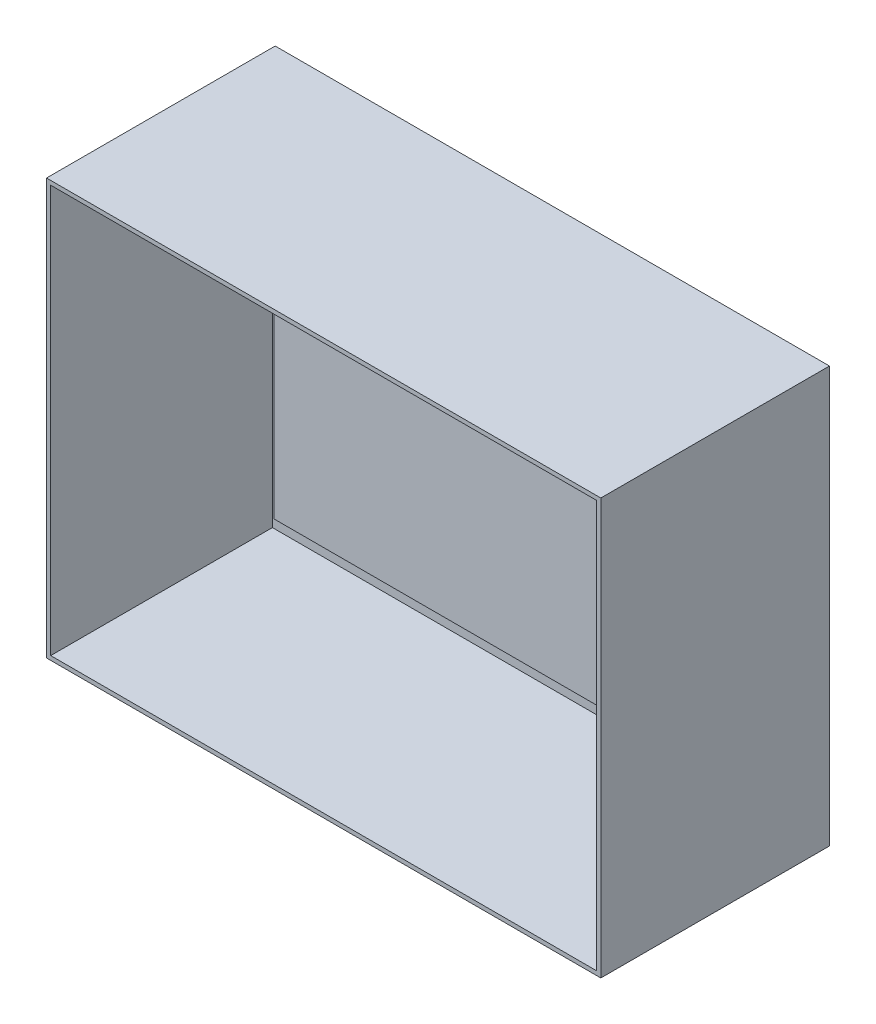
ISO-10303-21;
HEADER;
FILE_DESCRIPTION(('STEP AP214'),'2;1');
FILE_NAME('part.step','',(''),(''),'','','');
FILE_SCHEMA(('AUTOMOTIVE_DESIGN { 1 0 10303 214 1 1 1 1 }'));
ENDSEC;
DATA;
#1=APPLICATION_CONTEXT('core data for automotive mechanical design processes');
#2=APPLICATION_PROTOCOL_DEFINITION('international standard','automotive_design',2000,#1);
#3=PRODUCT_CONTEXT('',#1,'mechanical');
#4=PRODUCT('Part','Part','',(#3));
#5=PRODUCT_RELATED_PRODUCT_CATEGORY('part','',(#4));
#6=PRODUCT_DEFINITION_FORMATION('','',#4);
#7=PRODUCT_DEFINITION_CONTEXT('part definition',#1,'design');
#8=PRODUCT_DEFINITION('design','',#6,#7);
#9=PRODUCT_DEFINITION_SHAPE('','',#8);
#10=(LENGTH_UNIT() NAMED_UNIT(*) SI_UNIT(.MILLI.,.METRE.));
#11=(NAMED_UNIT(*) PLANE_ANGLE_UNIT() SI_UNIT($,.RADIAN.));
#12=(NAMED_UNIT(*) SI_UNIT($,.STERADIAN.) SOLID_ANGLE_UNIT());
#13=UNCERTAINTY_MEASURE_WITH_UNIT(LENGTH_MEASURE(1.E-05),#10,'distance_accuracy_value','');
#14=(GEOMETRIC_REPRESENTATION_CONTEXT(3) GLOBAL_UNCERTAINTY_ASSIGNED_CONTEXT((#13)) GLOBAL_UNIT_ASSIGNED_CONTEXT((#10,
#11,#12)) REPRESENTATION_CONTEXT('',''));
#15=CARTESIAN_POINT('',(0.,0.,0.));
#16=DIRECTION('',(0.,0.,1.));
#17=DIRECTION('',(1.,0.,0.));
#18=AXIS2_PLACEMENT_3D('',#15,#16,#17);
#19=CARTESIAN_POINT('',(0.,0.,5.));
#20=DIRECTION('',(0.,0.,1.));
#21=DIRECTION('',(1.,0.,0.));
#22=AXIS2_PLACEMENT_3D('',#19,#20,#21);
#23=PLANE('',#22);
#24=DIRECTION('',(0.,1.,0.));
#25=VECTOR('',#24,1.);
#26=CARTESIAN_POINT('',(-197.,0.,5.));
#27=LINE('',#26,#25);
#28=CARTESIAN_POINT('',(-197.,-147.,5.));
#29=VERTEX_POINT('',#28);
#30=CARTESIAN_POINT('',(-197.,147.,5.));
#31=VERTEX_POINT('',#30);
#32=EDGE_CURVE('E56',#29,#31,#27,.T.);
#33=ORIENTED_EDGE('',*,*,#32,.F.);
#34=DIRECTION('',(-1.,0.,0.));
#35=VECTOR('',#34,1.);
#36=CARTESIAN_POINT('',(0.,-147.,5.));
#37=LINE('',#36,#35);
#38=CARTESIAN_POINT('',(197.,-147.,5.));
#39=VERTEX_POINT('',#38);
#40=EDGE_CURVE('E187',#39,#29,#37,.T.);
#41=ORIENTED_EDGE('',*,*,#40,.F.);
#42=DIRECTION('',(0.,-1.,0.));
#43=VECTOR('',#42,1.);
#44=CARTESIAN_POINT('',(197.,0.,5.));
#45=LINE('',#44,#43);
#46=CARTESIAN_POINT('',(197.,147.,5.));
#47=VERTEX_POINT('',#46);
#48=EDGE_CURVE('E184',#47,#39,#45,.T.);
#49=ORIENTED_EDGE('',*,*,#48,.F.);
#50=DIRECTION('',(1.,0.,0.));
#51=VECTOR('',#50,1.);
#52=CARTESIAN_POINT('',(0.,147.,5.));
#53=LINE('',#52,#51);
#54=EDGE_CURVE('E181',#31,#47,#53,.T.);
#55=ORIENTED_EDGE('',*,*,#54,.F.);
#56=EDGE_LOOP('',(#33,#41,#49,#55));
#57=FACE_BOUND('',#56,.T.);
#58=DIRECTION('',(1.,0.,0.));
#59=VECTOR('',#58,1.);
#60=CARTESIAN_POINT('',(0.,120.,5.));
#61=LINE('',#60,#59);
#62=CARTESIAN_POINT('',(-175.,120.,5.00000000000001));
#63=VERTEX_POINT('',#62);
#64=CARTESIAN_POINT('',(175.,120.,5.00000000000001));
#65=VERTEX_POINT('',#64);
#66=EDGE_CURVE('E41',#63,#65,#61,.T.);
#67=ORIENTED_EDGE('',*,*,#66,.T.);
#68=DIRECTION('',(0.,-1.,0.));
#69=VECTOR('',#68,1.);
#70=CARTESIAN_POINT('',(175.,0.,5.));
#71=LINE('',#70,#69);
#72=CARTESIAN_POINT('',(175.,-120.,5.00000000000001));
#73=VERTEX_POINT('',#72);
#74=EDGE_CURVE('E11',#65,#73,#71,.T.);
#75=ORIENTED_EDGE('',*,*,#74,.T.);
#76=DIRECTION('',(-1.,0.,0.));
#77=VECTOR('',#76,1.);
#78=CARTESIAN_POINT('',(0.,-120.,5.));
#79=LINE('',#78,#77);
#80=CARTESIAN_POINT('',(-175.,-120.,5.));
#81=VERTEX_POINT('',#80);
#82=EDGE_CURVE('E211',#73,#81,#79,.T.);
#83=ORIENTED_EDGE('',*,*,#82,.T.);
#84=DIRECTION('',(0.,1.,0.));
#85=VECTOR('',#84,1.);
#86=CARTESIAN_POINT('',(-175.,0.,5.));
#87=LINE('',#86,#85);
#88=EDGE_CURVE('E214',#81,#63,#87,.T.);
#89=ORIENTED_EDGE('',*,*,#88,.T.);
#90=EDGE_LOOP('',(#67,#75,#83,#89));
#91=FACE_BOUND('',#90,.T.);
#92=ADVANCED_FACE('F33',(#57,#91),#23,.T.);
#93=CARTESIAN_POINT('',(200.,150.,5.));
#94=DIRECTION('',(-1.,0.,0.));
#95=DIRECTION('',(0.,-1.,0.));
#96=AXIS2_PLACEMENT_3D('',#93,#94,#95);
#97=PLANE('',#96);
#98=DIRECTION('',(0.,1.,0.));
#99=VECTOR('',#98,1.);
#100=CARTESIAN_POINT('',(200.,150.,0.));
#101=LINE('',#100,#99);
#102=CARTESIAN_POINT('',(200.,-150.,0.));
#103=VERTEX_POINT('',#102);
#104=CARTESIAN_POINT('',(200.,150.,0.));
#105=VERTEX_POINT('',#104);
#106=EDGE_CURVE('E190',#103,#105,#101,.T.);
#107=ORIENTED_EDGE('',*,*,#106,.T.);
#108=DIRECTION('',(0.,0.,-1.));
#109=VECTOR('',#108,1.);
#110=CARTESIAN_POINT('',(200.,150.,5.));
#111=LINE('',#110,#109);
#112=CARTESIAN_POINT('',(200.,150.,165.));
#113=VERTEX_POINT('',#112);
#114=EDGE_CURVE('E208',#113,#105,#111,.T.);
#115=ORIENTED_EDGE('',*,*,#114,.F.);
#116=DIRECTION('',(0.,1.,0.));
#117=VECTOR('',#116,1.);
#118=CARTESIAN_POINT('',(200.,150.,165.));
#119=LINE('',#118,#117);
#120=CARTESIAN_POINT('',(200.,-150.,165.));
#121=VERTEX_POINT('',#120);
#122=EDGE_CURVE('E175',#121,#113,#119,.T.);
#123=ORIENTED_EDGE('',*,*,#122,.F.);
#124=DIRECTION('',(0.,0.,-1.));
#125=VECTOR('',#124,1.);
#126=CARTESIAN_POINT('',(200.,-150.,5.));
#127=LINE('',#126,#125);
#128=EDGE_CURVE('E199',#121,#103,#127,.T.);
#129=ORIENTED_EDGE('',*,*,#128,.T.);
#130=EDGE_LOOP('',(#107,#115,#123,#129));
#131=FACE_BOUND('',#130,.T.);
#132=ADVANCED_FACE('F35',(#131),#97,.F.);
#133=CARTESIAN_POINT('',(-200.,150.,5.));
#134=DIRECTION('',(0.,-1.,0.));
#135=DIRECTION('',(0.,0.,-1.));
#136=AXIS2_PLACEMENT_3D('',#133,#134,#135);
#137=PLANE('',#136);
#138=DIRECTION('',(-1.,0.,0.));
#139=VECTOR('',#138,1.);
#140=CARTESIAN_POINT('',(-200.,150.,0.));
#141=LINE('',#140,#139);
#142=CARTESIAN_POINT('',(-200.,150.,0.));
#143=VERTEX_POINT('',#142);
#144=EDGE_CURVE('E193',#105,#143,#141,.T.);
#145=ORIENTED_EDGE('',*,*,#144,.T.);
#146=DIRECTION('',(0.,0.,-1.));
#147=VECTOR('',#146,1.);
#148=CARTESIAN_POINT('',(-200.,150.,5.));
#149=LINE('',#148,#147);
#150=CARTESIAN_POINT('',(-200.,150.,165.));
#151=VERTEX_POINT('',#150);
#152=EDGE_CURVE('E205',#151,#143,#149,.T.);
#153=ORIENTED_EDGE('',*,*,#152,.F.);
#154=DIRECTION('',(-1.,0.,0.));
#155=VECTOR('',#154,1.);
#156=CARTESIAN_POINT('',(-200.,150.,165.));
#157=LINE('',#156,#155);
#158=EDGE_CURVE('E178',#113,#151,#157,.T.);
#159=ORIENTED_EDGE('',*,*,#158,.F.);
#160=ORIENTED_EDGE('',*,*,#114,.T.);
#161=EDGE_LOOP('',(#145,#153,#159,#160));
#162=FACE_BOUND('',#161,.T.);
#163=ADVANCED_FACE('F237',(#162),#137,.F.);
#164=CARTESIAN_POINT('',(-200.,150.,5.));
#165=DIRECTION('',(1.,0.,0.));
#166=DIRECTION('',(0.,1.,0.));
#167=AXIS2_PLACEMENT_3D('',#164,#165,#166);
#168=PLANE('',#167);
#169=DIRECTION('',(0.,-1.,0.));
#170=VECTOR('',#169,1.);
#171=CARTESIAN_POINT('',(-200.,150.,0.));
#172=LINE('',#171,#170);
#173=CARTESIAN_POINT('',(-200.,-150.,0.));
#174=VERTEX_POINT('',#173);
#175=EDGE_CURVE('E195',#143,#174,#172,.T.);
#176=ORIENTED_EDGE('',*,*,#175,.T.);
#177=DIRECTION('',(0.,0.,-1.));
#178=VECTOR('',#177,1.);
#179=CARTESIAN_POINT('',(-200.,-150.,5.));
#180=LINE('',#179,#178);
#181=CARTESIAN_POINT('',(-200.,-150.,165.));
#182=VERTEX_POINT('',#181);
#183=EDGE_CURVE('E202',#182,#174,#180,.T.);
#184=ORIENTED_EDGE('',*,*,#183,.F.);
#185=DIRECTION('',(0.,-1.,0.));
#186=VECTOR('',#185,1.);
#187=CARTESIAN_POINT('',(-200.,150.,165.));
#188=LINE('',#187,#186);
#189=EDGE_CURVE('E169',#151,#182,#188,.T.);
#190=ORIENTED_EDGE('',*,*,#189,.F.);
#191=ORIENTED_EDGE('',*,*,#152,.T.);
#192=EDGE_LOOP('',(#176,#184,#190,#191));
#193=FACE_BOUND('',#192,.T.);
#194=ADVANCED_FACE('F250',(#193),#168,.F.);
#195=CARTESIAN_POINT('',(-200.,-150.,5.));
#196=DIRECTION('',(0.,1.,0.));
#197=DIRECTION('',(0.,0.,1.));
#198=AXIS2_PLACEMENT_3D('',#195,#196,#197);
#199=PLANE('',#198);
#200=DIRECTION('',(1.,0.,0.));
#201=VECTOR('',#200,1.);
#202=CARTESIAN_POINT('',(-200.,-150.,0.));
#203=LINE('',#202,#201);
#204=EDGE_CURVE('E197',#174,#103,#203,.T.);
#205=ORIENTED_EDGE('',*,*,#204,.T.);
#206=ORIENTED_EDGE('',*,*,#128,.F.);
#207=DIRECTION('',(1.,0.,0.));
#208=VECTOR('',#207,1.);
#209=CARTESIAN_POINT('',(-200.,-150.,165.));
#210=LINE('',#209,#208);
#211=EDGE_CURVE('E172',#182,#121,#210,.T.);
#212=ORIENTED_EDGE('',*,*,#211,.F.);
#213=ORIENTED_EDGE('',*,*,#183,.T.);
#214=EDGE_LOOP('',(#205,#206,#212,#213));
#215=FACE_BOUND('',#214,.T.);
#216=ADVANCED_FACE('F246',(#215),#199,.F.);
#217=CARTESIAN_POINT('',(0.,0.,0.));
#218=DIRECTION('',(0.,0.,1.));
#219=DIRECTION('',(1.,0.,0.));
#220=AXIS2_PLACEMENT_3D('',#217,#218,#219);
#221=PLANE('',#220);
#222=ORIENTED_EDGE('',*,*,#106,.F.);
#223=ORIENTED_EDGE('',*,*,#204,.F.);
#224=ORIENTED_EDGE('',*,*,#175,.F.);
#225=ORIENTED_EDGE('',*,*,#144,.F.);
#226=EDGE_LOOP('',(#222,#223,#224,#225));
#227=FACE_BOUND('',#226,.T.);
#228=ADVANCED_FACE('F243',(#227),#221,.F.);
#229=CARTESIAN_POINT('',(0.,0.,165.));
#230=DIRECTION('',(0.,0.,1.));
#231=DIRECTION('',(1.,0.,0.));
#232=AXIS2_PLACEMENT_3D('',#229,#230,#231);
#233=PLANE('',#232);
#234=ORIENTED_EDGE('',*,*,#189,.T.);
#235=ORIENTED_EDGE('',*,*,#211,.T.);
#236=ORIENTED_EDGE('',*,*,#122,.T.);
#237=ORIENTED_EDGE('',*,*,#158,.T.);
#238=EDGE_LOOP('',(#234,#235,#236,#237));
#239=FACE_BOUND('',#238,.T.);
#240=DIRECTION('',(1.,0.,0.));
#241=VECTOR('',#240,1.);
#242=CARTESIAN_POINT('',(-197.,-147.,165.));
#243=LINE('',#242,#241);
#244=CARTESIAN_POINT('',(-197.,-147.,165.));
#245=VERTEX_POINT('',#244);
#246=CARTESIAN_POINT('',(197.,-147.,165.));
#247=VERTEX_POINT('',#246);
#248=EDGE_CURVE('E146',#245,#247,#243,.T.);
#249=ORIENTED_EDGE('',*,*,#248,.F.);
#250=DIRECTION('',(0.,-1.,0.));
#251=VECTOR('',#250,1.);
#252=CARTESIAN_POINT('',(-197.,147.,165.));
#253=LINE('',#252,#251);
#254=CARTESIAN_POINT('',(-197.,147.,165.));
#255=VERTEX_POINT('',#254);
#256=EDGE_CURVE('E144',#255,#245,#253,.T.);
#257=ORIENTED_EDGE('',*,*,#256,.F.);
#258=DIRECTION('',(-1.,0.,0.));
#259=VECTOR('',#258,1.);
#260=CARTESIAN_POINT('',(-197.,147.,165.));
#261=LINE('',#260,#259);
#262=CARTESIAN_POINT('',(197.,147.,165.));
#263=VERTEX_POINT('',#262);
#264=EDGE_CURVE('E155',#263,#255,#261,.T.);
#265=ORIENTED_EDGE('',*,*,#264,.F.);
#266=DIRECTION('',(0.,1.,0.));
#267=VECTOR('',#266,1.);
#268=CARTESIAN_POINT('',(197.,147.,165.));
#269=LINE('',#268,#267);
#270=EDGE_CURVE('E152',#247,#263,#269,.T.);
#271=ORIENTED_EDGE('',*,*,#270,.F.);
#272=EDGE_LOOP('',(#249,#257,#265,#271));
#273=FACE_BOUND('',#272,.T.);
#274=ADVANCED_FACE('F241',(#239,#273),#233,.T.);
#275=CARTESIAN_POINT('',(-197.,147.,165.));
#276=DIRECTION('',(1.,0.,0.));
#277=DIRECTION('',(0.,1.,0.));
#278=AXIS2_PLACEMENT_3D('',#275,#276,#277);
#279=PLANE('',#278);
#280=DIRECTION('',(0.,0.,-1.));
#281=VECTOR('',#280,1.);
#282=CARTESIAN_POINT('',(-197.,-147.,165.));
#283=LINE('',#282,#281);
#284=EDGE_CURVE('E166',#245,#29,#283,.T.);
#285=ORIENTED_EDGE('',*,*,#284,.T.);
#286=ORIENTED_EDGE('',*,*,#32,.T.);
#287=DIRECTION('',(0.,0.,-1.));
#288=VECTOR('',#287,1.);
#289=CARTESIAN_POINT('',(-197.,147.,165.));
#290=LINE('',#289,#288);
#291=EDGE_CURVE('E157',#255,#31,#290,.T.);
#292=ORIENTED_EDGE('',*,*,#291,.F.);
#293=ORIENTED_EDGE('',*,*,#256,.T.);
#294=EDGE_LOOP('',(#285,#286,#292,#293));
#295=FACE_BOUND('',#294,.T.);
#296=ADVANCED_FACE('F268',(#295),#279,.T.);
#297=CARTESIAN_POINT('',(-197.,-147.,165.));
#298=DIRECTION('',(0.,1.,0.));
#299=DIRECTION('',(0.,0.,1.));
#300=AXIS2_PLACEMENT_3D('',#297,#298,#299);
#301=PLANE('',#300);
#302=DIRECTION('',(0.,0.,-1.));
#303=VECTOR('',#302,1.);
#304=CARTESIAN_POINT('',(197.,-147.,165.));
#305=LINE('',#304,#303);
#306=EDGE_CURVE('E163',#247,#39,#305,.T.);
#307=ORIENTED_EDGE('',*,*,#306,.T.);
#308=ORIENTED_EDGE('',*,*,#40,.T.);
#309=ORIENTED_EDGE('',*,*,#284,.F.);
#310=ORIENTED_EDGE('',*,*,#248,.T.);
#311=EDGE_LOOP('',(#307,#308,#309,#310));
#312=FACE_BOUND('',#311,.T.);
#313=ADVANCED_FACE('F276',(#312),#301,.T.);
#314=CARTESIAN_POINT('',(197.,147.,165.));
#315=DIRECTION('',(-1.,0.,0.));
#316=DIRECTION('',(0.,-1.,0.));
#317=AXIS2_PLACEMENT_3D('',#314,#315,#316);
#318=PLANE('',#317);
#319=DIRECTION('',(0.,0.,-1.));
#320=VECTOR('',#319,1.);
#321=CARTESIAN_POINT('',(197.,147.,165.));
#322=LINE('',#321,#320);
#323=EDGE_CURVE('E160',#263,#47,#322,.T.);
#324=ORIENTED_EDGE('',*,*,#323,.T.);
#325=ORIENTED_EDGE('',*,*,#48,.T.);
#326=ORIENTED_EDGE('',*,*,#306,.F.);
#327=ORIENTED_EDGE('',*,*,#270,.T.);
#328=EDGE_LOOP('',(#324,#325,#326,#327));
#329=FACE_BOUND('',#328,.T.);
#330=ADVANCED_FACE('F278',(#329),#318,.T.);
#331=CARTESIAN_POINT('',(-197.,147.,165.));
#332=DIRECTION('',(0.,-1.,0.));
#333=DIRECTION('',(0.,0.,-1.));
#334=AXIS2_PLACEMENT_3D('',#331,#332,#333);
#335=PLANE('',#334);
#336=ORIENTED_EDGE('',*,*,#291,.T.);
#337=ORIENTED_EDGE('',*,*,#54,.T.);
#338=ORIENTED_EDGE('',*,*,#323,.F.);
#339=ORIENTED_EDGE('',*,*,#264,.T.);
#340=EDGE_LOOP('',(#336,#337,#338,#339));
#341=FACE_BOUND('',#340,.T.);
#342=ADVANCED_FACE('F280',(#341),#335,.T.);
#343=CARTESIAN_POINT('',(175.,120.,26.));
#344=DIRECTION('',(-1.,0.,0.));
#345=DIRECTION('',(0.,-1.,0.));
#346=AXIS2_PLACEMENT_3D('',#343,#344,#345);
#347=PLANE('',#346);
#348=ORIENTED_EDGE('',*,*,#74,.F.);
#349=DIRECTION('',(0.,0.,-1.));
#350=VECTOR('',#349,1.);
#351=CARTESIAN_POINT('',(175.,120.,26.));
#352=LINE('',#351,#350);
#353=CARTESIAN_POINT('',(175.,120.,26.));
#354=VERTEX_POINT('',#353);
#355=EDGE_CURVE('E127',#354,#65,#352,.T.);
#356=ORIENTED_EDGE('',*,*,#355,.F.);
#357=DIRECTION('',(0.,1.,0.));
#358=VECTOR('',#357,1.);
#359=CARTESIAN_POINT('',(175.,120.,26.));
#360=LINE('',#359,#358);
#361=CARTESIAN_POINT('',(175.,-120.,26.));
#362=VERTEX_POINT('',#361);
#363=EDGE_CURVE('E134',#362,#354,#360,.T.);
#364=ORIENTED_EDGE('',*,*,#363,.F.);
#365=DIRECTION('',(0.,0.,-1.));
#366=VECTOR('',#365,1.);
#367=CARTESIAN_POINT('',(175.,-120.,26.));
#368=LINE('',#367,#366);
#369=EDGE_CURVE('E220',#362,#73,#368,.T.);
#370=ORIENTED_EDGE('',*,*,#369,.T.);
#371=EDGE_LOOP('',(#348,#356,#364,#370));
#372=FACE_BOUND('',#371,.T.);
#373=ADVANCED_FACE('F143',(#372),#347,.F.);
#374=CARTESIAN_POINT('',(-175.,120.,26.));
#375=DIRECTION('',(0.,-1.,0.));
#376=DIRECTION('',(0.,0.,-1.));
#377=AXIS2_PLACEMENT_3D('',#374,#375,#376);
#378=PLANE('',#377);
#379=ORIENTED_EDGE('',*,*,#66,.F.);
#380=DIRECTION('',(0.,0.,-1.));
#381=VECTOR('',#380,1.);
#382=CARTESIAN_POINT('',(-175.,120.,26.));
#383=LINE('',#382,#381);
#384=CARTESIAN_POINT('',(-175.,120.,26.));
#385=VERTEX_POINT('',#384);
#386=EDGE_CURVE('E130',#385,#63,#383,.T.);
#387=ORIENTED_EDGE('',*,*,#386,.F.);
#388=DIRECTION('',(-1.,0.,0.));
#389=VECTOR('',#388,1.);
#390=CARTESIAN_POINT('',(-175.,120.,26.));
#391=LINE('',#390,#389);
#392=EDGE_CURVE('E123',#354,#385,#391,.T.);
#393=ORIENTED_EDGE('',*,*,#392,.F.);
#394=ORIENTED_EDGE('',*,*,#355,.T.);
#395=EDGE_LOOP('',(#379,#387,#393,#394));
#396=FACE_BOUND('',#395,.T.);
#397=ADVANCED_FACE('F125',(#396),#378,.F.);
#398=CARTESIAN_POINT('',(-175.,120.,26.));
#399=DIRECTION('',(1.,0.,0.));
#400=DIRECTION('',(0.,1.,0.));
#401=AXIS2_PLACEMENT_3D('',#398,#399,#400);
#402=PLANE('',#401);
#403=ORIENTED_EDGE('',*,*,#88,.F.);
#404=DIRECTION('',(0.,0.,-1.));
#405=VECTOR('',#404,1.);
#406=CARTESIAN_POINT('',(-175.,-120.,26.));
#407=LINE('',#406,#405);
#408=CARTESIAN_POINT('',(-175.,-120.,26.));
#409=VERTEX_POINT('',#408);
#410=EDGE_CURVE('E48',#409,#81,#407,.T.);
#411=ORIENTED_EDGE('',*,*,#410,.F.);
#412=DIRECTION('',(0.,-1.,0.));
#413=VECTOR('',#412,1.);
#414=CARTESIAN_POINT('',(-175.,120.,26.));
#415=LINE('',#414,#413);
#416=EDGE_CURVE('E133',#385,#409,#415,.T.);
#417=ORIENTED_EDGE('',*,*,#416,.F.);
#418=ORIENTED_EDGE('',*,*,#386,.T.);
#419=EDGE_LOOP('',(#403,#411,#417,#418));
#420=FACE_BOUND('',#419,.T.);
#421=ADVANCED_FACE('F218',(#420),#402,.F.);
#422=CARTESIAN_POINT('',(-175.,-120.,26.));
#423=DIRECTION('',(0.,1.,0.));
#424=DIRECTION('',(0.,0.,1.));
#425=AXIS2_PLACEMENT_3D('',#422,#423,#424);
#426=PLANE('',#425);
#427=ORIENTED_EDGE('',*,*,#82,.F.);
#428=ORIENTED_EDGE('',*,*,#369,.F.);
#429=DIRECTION('',(1.,0.,0.));
#430=VECTOR('',#429,1.);
#431=CARTESIAN_POINT('',(-175.,-120.,26.));
#432=LINE('',#431,#430);
#433=EDGE_CURVE('E138',#409,#362,#432,.T.);
#434=ORIENTED_EDGE('',*,*,#433,.F.);
#435=ORIENTED_EDGE('',*,*,#410,.T.);
#436=EDGE_LOOP('',(#427,#428,#434,#435));
#437=FACE_BOUND('',#436,.T.);
#438=ADVANCED_FACE('F223',(#437),#426,.F.);
#439=CARTESIAN_POINT('',(0.,0.,26.));
#440=DIRECTION('',(0.,0.,1.));
#441=DIRECTION('',(1.,0.,0.));
#442=AXIS2_PLACEMENT_3D('',#439,#440,#441);
#443=PLANE('',#442);
#444=ORIENTED_EDGE('',*,*,#363,.T.);
#445=ORIENTED_EDGE('',*,*,#392,.T.);
#446=ORIENTED_EDGE('',*,*,#416,.T.);
#447=ORIENTED_EDGE('',*,*,#433,.T.);
#448=EDGE_LOOP('',(#444,#445,#446,#447));
#449=FACE_BOUND('',#448,.T.);
#450=ADVANCED_FACE('F137',(#449),#443,.T.);
#451=CLOSED_SHELL('',(#92,#132,#163,#194,#216,#228,#274,#296,#313,#330,#342,#373,#397,#421,#438,#450));
#452=MANIFOLD_SOLID_BREP('B2',#451);
#453=ADVANCED_BREP_SHAPE_REPRESENTATION('',(#18,#452),#14);
#454=SHAPE_DEFINITION_REPRESENTATION(#9,#453);
ENDSEC;
END-ISO-10303-21;
